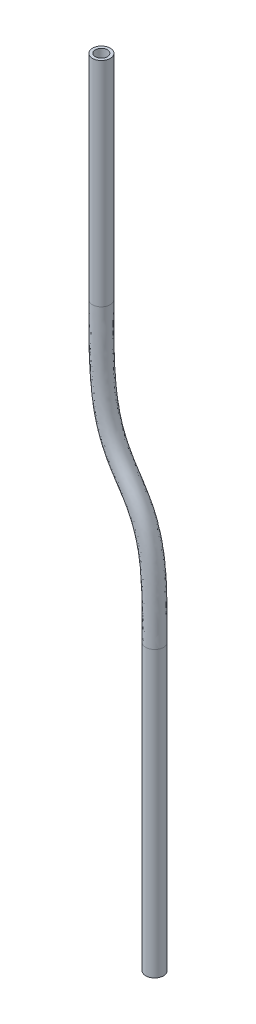
ISO-10303-21;
HEADER;
FILE_DESCRIPTION(('STEP AP214'),'2;1');
FILE_NAME('part.step','',(''),(''),'','','');
FILE_SCHEMA(('AUTOMOTIVE_DESIGN { 1 0 10303 214 1 1 1 1 }'));
ENDSEC;
DATA;
#1=APPLICATION_CONTEXT('core data for automotive mechanical design processes');
#2=APPLICATION_PROTOCOL_DEFINITION('international standard','automotive_design',2000,#1);
#3=PRODUCT_CONTEXT('',#1,'mechanical');
#4=PRODUCT('Part','Part','',(#3));
#5=PRODUCT_RELATED_PRODUCT_CATEGORY('part','',(#4));
#6=PRODUCT_DEFINITION_FORMATION('','',#4);
#7=PRODUCT_DEFINITION_CONTEXT('part definition',#1,'design');
#8=PRODUCT_DEFINITION('design','',#6,#7);
#9=PRODUCT_DEFINITION_SHAPE('','',#8);
#10=(LENGTH_UNIT() NAMED_UNIT(*) SI_UNIT(.MILLI.,.METRE.));
#11=(NAMED_UNIT(*) PLANE_ANGLE_UNIT() SI_UNIT($,.RADIAN.));
#12=(NAMED_UNIT(*) SI_UNIT($,.STERADIAN.) SOLID_ANGLE_UNIT());
#13=UNCERTAINTY_MEASURE_WITH_UNIT(LENGTH_MEASURE(1.E-05),#10,'distance_accuracy_value','');
#14=(GEOMETRIC_REPRESENTATION_CONTEXT(3) GLOBAL_UNCERTAINTY_ASSIGNED_CONTEXT((#13)) GLOBAL_UNIT_ASSIGNED_CONTEXT((#10,
#11,#12)) REPRESENTATION_CONTEXT('',''));
#15=CARTESIAN_POINT('',(0.,0.,0.));
#16=DIRECTION('',(0.,0.,1.));
#17=DIRECTION('',(1.,0.,0.));
#18=AXIS2_PLACEMENT_3D('',#15,#16,#17);
#19=CARTESIAN_POINT('',(0.,0.,0.));
#20=DIRECTION('',(0.,1.,0.));
#21=DIRECTION('',(-1.,0.,0.));
#22=AXIS2_PLACEMENT_3D('',#19,#20,#21);
#23=CYLINDRICAL_SURFACE('',#22,3.175);
#24=CARTESIAN_POINT('',(0.,0.,0.));
#25=DIRECTION('',(0.,-1.,0.));
#26=DIRECTION('',(1.,0.,0.));
#27=AXIS2_PLACEMENT_3D('',#24,#25,#26);
#28=CIRCLE('',#27,3.175);
#29=CARTESIAN_POINT('',(3.17499999999999,0.,0.));
#30=VERTEX_POINT('',#29);
#31=EDGE_CURVE('E125',#30,#30,#28,.T.);
#32=ORIENTED_EDGE('',*,*,#31,.F.);
#33=DIRECTION('',(0.,1.,0.));
#34=VECTOR('',#33,1.);
#35=CARTESIAN_POINT('',(3.17499999999999,0.,0.));
#36=LINE('',#35,#34);
#37=CARTESIAN_POINT('',(3.17499999999999,76.2000000000001,0.));
#38=VERTEX_POINT('',#37);
#39=EDGE_CURVE('E12',#30,#38,#36,.T.);
#40=ORIENTED_EDGE('',*,*,#39,.T.);
#41=CARTESIAN_POINT('',(0.,76.2000000000001,0.));
#42=DIRECTION('',(0.,-1.,0.));
#43=DIRECTION('',(1.,0.,0.));
#44=AXIS2_PLACEMENT_3D('',#41,#42,#43);
#45=CIRCLE('',#44,3.175);
#46=EDGE_CURVE('E85',#38,#38,#45,.T.);
#47=ORIENTED_EDGE('',*,*,#46,.T.);
#48=ORIENTED_EDGE('',*,*,#39,.F.);
#49=EDGE_LOOP('',(#32,#40,#47,#48));
#50=FACE_BOUND('',#49,.T.);
#51=ADVANCED_FACE('F75',(#50),#23,.T.);
#52=CARTESIAN_POINT('',(0.,0.,0.));
#53=DIRECTION('',(0.,1.,0.));
#54=DIRECTION('',(-1.,0.,0.));
#55=AXIS2_PLACEMENT_3D('',#52,#53,#54);
#56=CYLINDRICAL_SURFACE('',#55,2.159);
#57=CARTESIAN_POINT('',(0.,0.,0.));
#58=DIRECTION('',(0.,-1.,0.));
#59=DIRECTION('',(1.,0.,0.));
#60=AXIS2_PLACEMENT_3D('',#57,#58,#59);
#61=CIRCLE('',#60,2.159);
#62=CARTESIAN_POINT('',(2.15899999999999,0.,0.));
#63=VERTEX_POINT('',#62);
#64=EDGE_CURVE('E136',#63,#63,#61,.T.);
#65=ORIENTED_EDGE('',*,*,#64,.T.);
#66=DIRECTION('',(0.,1.,0.));
#67=VECTOR('',#66,1.);
#68=CARTESIAN_POINT('',(2.15899999999999,0.,0.));
#69=LINE('',#68,#67);
#70=CARTESIAN_POINT('',(2.15899999999999,76.2000000000001,0.));
#71=VERTEX_POINT('',#70);
#72=EDGE_CURVE('E131',#63,#71,#69,.T.);
#73=ORIENTED_EDGE('',*,*,#72,.T.);
#74=CARTESIAN_POINT('',(0.,76.2000000000001,0.));
#75=DIRECTION('',(0.,-1.,0.));
#76=DIRECTION('',(1.,0.,0.));
#77=AXIS2_PLACEMENT_3D('',#74,#75,#76);
#78=CIRCLE('',#77,2.159);
#79=EDGE_CURVE('E98',#71,#71,#78,.T.);
#80=ORIENTED_EDGE('',*,*,#79,.F.);
#81=ORIENTED_EDGE('',*,*,#72,.F.);
#82=EDGE_LOOP('',(#65,#73,#80,#81));
#83=FACE_BOUND('',#82,.T.);
#84=ADVANCED_FACE('F167',(#83),#56,.F.);
#85=CARTESIAN_POINT('',(19.05,-96.4559617293823,0.));
#86=DIRECTION('',(0.,-1.,0.));
#87=DIRECTION('',(1.,0.,0.));
#88=AXIS2_PLACEMENT_3D('',#85,#86,#87);
#89=CYLINDRICAL_SURFACE('',#88,2.159);
#90=CARTESIAN_POINT('',(19.05,-96.4559617293823,0.));
#91=DIRECTION('',(0.,-1.,0.));
#92=DIRECTION('',(1.,0.,0.));
#93=AXIS2_PLACEMENT_3D('',#90,#91,#92);
#94=CIRCLE('',#93,2.159);
#95=CARTESIAN_POINT('',(21.209,-96.4559617293823,0.));
#96=VERTEX_POINT('',#95);
#97=EDGE_CURVE('E110',#96,#96,#94,.T.);
#98=ORIENTED_EDGE('',*,*,#97,.F.);
#99=EDGE_LOOP('',(#98));
#100=FACE_BOUND('',#99,.T.);
#101=CARTESIAN_POINT('',(19.05,-198.055961729382,0.));
#102=DIRECTION('',(0.,-1.,0.));
#103=DIRECTION('',(1.,0.,0.));
#104=AXIS2_PLACEMENT_3D('',#101,#102,#103);
#105=CIRCLE('',#104,2.159);
#106=CARTESIAN_POINT('',(21.209,-198.055961729382,0.));
#107=VERTEX_POINT('',#106);
#108=EDGE_CURVE('E122',#107,#107,#105,.T.);
#109=ORIENTED_EDGE('',*,*,#108,.T.);
#110=EDGE_LOOP('',(#109));
#111=FACE_BOUND('',#110,.T.);
#112=ADVANCED_FACE('F111',(#100,#111),#89,.F.);
#113=CARTESIAN_POINT('',(19.05,-96.4559617293823,0.));
#114=DIRECTION('',(0.,-1.,0.));
#115=DIRECTION('',(1.,0.,0.));
#116=AXIS2_PLACEMENT_3D('',#113,#114,#115);
#117=CYLINDRICAL_SURFACE('',#116,3.175);
#118=CARTESIAN_POINT('',(19.05,-96.4559617293823,0.));
#119=DIRECTION('',(0.,-1.,0.));
#120=DIRECTION('',(1.,0.,0.));
#121=AXIS2_PLACEMENT_3D('',#118,#119,#120);
#122=CIRCLE('',#121,3.175);
#123=CARTESIAN_POINT('',(22.225,-96.4559617293823,0.));
#124=VERTEX_POINT('',#123);
#125=EDGE_CURVE('E116',#124,#124,#122,.T.);
#126=ORIENTED_EDGE('',*,*,#125,.T.);
#127=EDGE_LOOP('',(#126));
#128=FACE_BOUND('',#127,.T.);
#129=CARTESIAN_POINT('',(19.05,-198.055961729382,0.));
#130=DIRECTION('',(0.,-1.,0.));
#131=DIRECTION('',(1.,0.,0.));
#132=AXIS2_PLACEMENT_3D('',#129,#130,#131);
#133=CIRCLE('',#132,3.175);
#134=CARTESIAN_POINT('',(22.225,-198.055961729382,0.));
#135=VERTEX_POINT('',#134);
#136=EDGE_CURVE('E117',#135,#135,#133,.T.);
#137=ORIENTED_EDGE('',*,*,#136,.F.);
#138=EDGE_LOOP('',(#137));
#139=FACE_BOUND('',#138,.T.);
#140=ADVANCED_FACE('F149',(#128,#139),#117,.T.);
#141=CARTESIAN_POINT('',(19.05,-198.055961729382,0.));
#142=DIRECTION('',(0.,-1.,0.));
#143=DIRECTION('',(1.,0.,0.));
#144=AXIS2_PLACEMENT_3D('',#141,#142,#143);
#145=PLANE('',#144);
#146=ORIENTED_EDGE('',*,*,#108,.F.);
#147=EDGE_LOOP('',(#146));
#148=FACE_BOUND('',#147,.T.);
#149=ORIENTED_EDGE('',*,*,#136,.T.);
#150=EDGE_LOOP('',(#149));
#151=FACE_BOUND('',#150,.T.);
#152=ADVANCED_FACE('F152',(#148,#151),#145,.T.);
#153=CARTESIAN_POINT('',(0.,76.2000000000001,0.));
#154=DIRECTION('',(0.,-1.,0.));
#155=DIRECTION('',(1.,0.,0.));
#156=AXIS2_PLACEMENT_3D('',#153,#154,#155);
#157=PLANE('',#156);
#158=ORIENTED_EDGE('',*,*,#79,.T.);
#159=EDGE_LOOP('',(#158));
#160=FACE_BOUND('',#159,.T.);
#161=ORIENTED_EDGE('',*,*,#46,.F.);
#162=EDGE_LOOP('',(#161));
#163=FACE_BOUND('',#162,.T.);
#164=ADVANCED_FACE('F157',(#160,#163),#157,.F.);
#165=CARTESIAN_POINT('',(22.225,-96.4559617293823,0.));
#166=CARTESIAN_POINT('',(22.225,-91.0119109936255,0.));
#167=CARTESIAN_POINT('',(22.1983255219202,-78.8834765321268,0.));
#168=CARTESIAN_POINT('',(20.9505032178214,-67.2755601045657,0.));
#169=CARTESIAN_POINT('',(18.0859037602269,-58.0508144624268,0.));
#170=CARTESIAN_POINT('',(14.0520757496162,-51.1831758916745,0.));
#171=CARTESIAN_POINT('',(10.2893681006252,-45.7430928816105,0.));
#172=CARTESIAN_POINT('',(7.35655304304436,-40.3507486722912,0.));
#173=CARTESIAN_POINT('',(5.22679144115826,-34.2606897503014,0.));
#174=CARTESIAN_POINT('',(3.80804832021998,-25.9627554061368,0.));
#175=CARTESIAN_POINT('',(3.18661095277607,-15.2887361010675,0.));
#176=CARTESIAN_POINT('',(3.17499999999999,-4.84579065420873,0.));
#177=CARTESIAN_POINT('',(3.17499999999999,0.,0.));
#178=CARTESIAN_POINT('',(22.225,-96.4559617293823,-6.35));
#179=CARTESIAN_POINT('',(22.225,-91.1563653622159,-6.35));
#180=CARTESIAN_POINT('',(22.1983255219202,-78.8164332912311,-6.35));
#181=CARTESIAN_POINT('',(20.9505032178214,-67.2935298948151,-6.35));
#182=CARTESIAN_POINT('',(18.0859037602268,-58.0459785423249,-6.35));
#183=CARTESIAN_POINT('',(14.0520757496162,-51.1845497818327,-6.35));
#184=CARTESIAN_POINT('',(10.2893681006252,-45.7425784932717,-6.35));
#185=CARTESIAN_POINT('',(7.35655304304435,-40.351520219269,-6.35));
#186=CARTESIAN_POINT('',(5.22679144115826,-34.2580107894528,-6.35));
#187=CARTESIAN_POINT('',(3.80804832021998,-25.9726997025534,-6.35));
#188=CARTESIAN_POINT('',(3.18661095277607,-15.2516378762499,-6.35));
#189=CARTESIAN_POINT('',(3.17499999999999,-4.92572364783858,-6.35));
#190=CARTESIAN_POINT('',(3.17499999999999,0.,-6.35));
#191=CARTESIAN_POINT('',(15.875,-96.4559617293823,-6.35));
#192=CARTESIAN_POINT('',(15.875,-91.1563653622159,-6.35));
#193=CARTESIAN_POINT('',(15.8448310067891,-78.9929845721256,-6.35));
#194=CARTESIAN_POINT('',(14.6521710337135,-68.4086743014929,-6.35));
#195=CARTESIAN_POINT('',(12.2263631447715,-60.6458339685584,-6.35));
#196=CARTESIAN_POINT('',(8.8116955529137,-54.7772079765875,-6.35));
#197=CARTESIAN_POINT('',(4.95750181909223,-49.2107313855515,-6.35));
#198=CARTESIAN_POINT('',(1.5194801211589,-42.9360358547135,-6.35));
#199=CARTESIAN_POINT('',(-0.97541756226488,-35.753418135562,-6.35));
#200=CARTESIAN_POINT('',(-2.52531672454958,-26.5795201729805,-6.35));
#201=CARTESIAN_POINT('',(-3.1646920303885,-15.3522980140792,-6.35));
#202=CARTESIAN_POINT('',(-3.17500000000001,-4.92572364783858,-6.35));
#203=CARTESIAN_POINT('',(-3.17500000000001,0.,-6.35));
#204=CARTESIAN_POINT('',(15.875,-96.4559617293823,0.));
#205=CARTESIAN_POINT('',(15.875,-91.0841381779207,0.));
#206=CARTESIAN_POINT('',(15.8448310067891,-79.0265061925735,0.));
#207=CARTESIAN_POINT('',(14.6521710337135,-68.3996894063682,0.));
#208=CARTESIAN_POINT('',(12.2263631447715,-60.6482519286093,0.));
#209=CARTESIAN_POINT('',(8.81169555291371,-54.7765210315084,0.));
#210=CARTESIAN_POINT('',(4.95750181909224,-49.2109885797209,0.));
#211=CARTESIAN_POINT('',(1.5194801211589,-42.9356500812247,0.));
#212=CARTESIAN_POINT('',(-0.975417562264881,-35.7547576159862,0.));
#213=CARTESIAN_POINT('',(-2.52531672454958,-26.5745480247722,0.));
#214=CARTESIAN_POINT('',(-3.16469203038851,-15.370847126488,0.));
#215=CARTESIAN_POINT('',(-3.17500000000001,-4.88575715102366,0.));
#216=CARTESIAN_POINT('',(-3.17500000000001,0.,0.));
#217=CARTESIAN_POINT('',(15.875,-96.4559617293823,6.35));
#218=CARTESIAN_POINT('',(15.875,-91.0119109936255,6.35));
#219=CARTESIAN_POINT('',(15.8448310067891,-79.0600278130213,6.35));
#220=CARTESIAN_POINT('',(14.6521710337135,-68.3907045112435,6.35));
#221=CARTESIAN_POINT('',(12.2263631447715,-60.6506698886603,6.35));
#222=CARTESIAN_POINT('',(8.8116955529137,-54.7758340864293,6.35));
#223=CARTESIAN_POINT('',(4.95750181909223,-49.2112457738903,6.35));
#224=CARTESIAN_POINT('',(1.5194801211589,-42.9352643077358,6.35));
#225=CARTESIAN_POINT('',(-0.97541756226488,-35.7560970964105,6.35));
#226=CARTESIAN_POINT('',(-2.52531672454958,-26.569575876564,6.35));
#227=CARTESIAN_POINT('',(-3.1646920303885,-15.3893962388967,6.35));
#228=CARTESIAN_POINT('',(-3.17500000000001,-4.84579065420873,6.35));
#229=CARTESIAN_POINT('',(-3.17500000000001,0.,6.35));
#230=CARTESIAN_POINT('',(22.225,-96.4559617293823,6.35));
#231=CARTESIAN_POINT('',(22.225,-90.8674566250351,6.35));
#232=CARTESIAN_POINT('',(22.1983255219202,-78.9505197730226,6.35));
#233=CARTESIAN_POINT('',(20.9505032178214,-67.2575903143163,6.35));
#234=CARTESIAN_POINT('',(18.0859037602268,-58.0556503825287,6.35));
#235=CARTESIAN_POINT('',(14.0520757496162,-51.1818020015163,6.35));
#236=CARTESIAN_POINT('',(10.2893681006252,-45.7436072699493,6.35));
#237=CARTESIAN_POINT('',(7.35655304304435,-40.3499771253135,6.35));
#238=CARTESIAN_POINT('',(5.22679144115826,-34.2633687111499,6.35));
#239=CARTESIAN_POINT('',(3.80804832021998,-25.9528111097203,6.35));
#240=CARTESIAN_POINT('',(3.18661095277607,-15.325834325885,6.35));
#241=CARTESIAN_POINT('',(3.17499999999999,-4.76585766057889,6.35));
#242=CARTESIAN_POINT('',(3.17499999999999,0.,6.35));
#243=CARTESIAN_POINT('',(22.225,-96.4559617293823,0.));
#244=CARTESIAN_POINT('',(22.225,-91.0119109936255,0.));
#245=CARTESIAN_POINT('',(22.1983255219202,-78.8834765321268,0.));
#246=CARTESIAN_POINT('',(20.9505032178214,-67.2755601045657,0.));
#247=CARTESIAN_POINT('',(18.0859037602269,-58.0508144624268,0.));
#248=CARTESIAN_POINT('',(14.0520757496162,-51.1831758916745,0.));
#249=CARTESIAN_POINT('',(10.2893681006252,-45.7430928816105,0.));
#250=CARTESIAN_POINT('',(7.35655304304436,-40.3507486722912,0.));
#251=CARTESIAN_POINT('',(5.22679144115826,-34.2606897503014,0.));
#252=CARTESIAN_POINT('',(3.80804832021998,-25.9627554061368,0.));
#253=CARTESIAN_POINT('',(3.18661095277607,-15.2887361010675,0.));
#254=CARTESIAN_POINT('',(3.17499999999999,-4.84579065420873,0.));
#255=CARTESIAN_POINT('',(3.17499999999999,0.,0.));
#256=(BOUNDED_SURFACE() B_SPLINE_SURFACE(3,3,((#165,#166,#167,#168,#169,#170,#171,#172,#173,
#174,#175,#176,#177),(#178,#179,#180,#181,#182,#183,#184,#185,#186,#187,#188,#189,#190),(#191,
#192,#193,#194,#195,#196,#197,#198,#199,#200,#201,#202,#203),(#204,#205,#206,#207,#208,#209,
#210,#211,#212,#213,#214,#215,#216),(#217,#218,#219,#220,#221,#222,#223,#224,#225,#226,#227,
#228,#229),(#230,#231,#232,#233,#234,#235,#236,#237,#238,#239,#240,#241,#242),(#243,#244,#245,
#246,#247,#248,#249,#250,#251,#252,#253,#254,#255)),.UNSPECIFIED.,.T.,.F.,
.F.) B_SPLINE_SURFACE_WITH_KNOTS((4,3,4),(4,1,1,1,1,1,1,1,1,1,4),(0.,0.5,1.),(0.,0.112,0.224,
0.336,0.448,0.56,0.648,0.736,0.824000000000001,0.912,1.),
.UNSPECIFIED.) GEOMETRIC_REPRESENTATION_ITEM() RATIONAL_B_SPLINE_SURFACE(((1.,1.,1.,1.,1.,1.,1.,
1.,1.,1.,1.,1.,1.),(0.333333333333333,0.333333333333333,0.333333333333333,0.333333333333333,
0.333333333333333,0.333333333333333,0.333333333333333,0.333333333333333,0.333333333333333,
0.333333333333333,0.333333333333333,0.333333333333333,0.333333333333333),(0.333333333333333,
0.333333333333333,0.333333333333333,0.333333333333333,0.333333333333333,0.333333333333333,
0.333333333333333,0.333333333333333,0.333333333333333,0.333333333333333,0.333333333333333,
0.333333333333333,0.333333333333333),(1.,1.,1.,1.,1.,1.,1.,1.,1.,1.,1.,1.,1.),
(0.333333333333333,0.333333333333333,0.333333333333333,0.333333333333333,0.333333333333333,
0.333333333333333,0.333333333333333,0.333333333333333,0.333333333333333,0.333333333333333,
0.333333333333333,0.333333333333333,0.333333333333333),(0.333333333333333,0.333333333333333,
0.333333333333333,0.333333333333333,0.333333333333333,0.333333333333333,0.333333333333333,
0.333333333333333,0.333333333333333,0.333333333333333,0.333333333333333,0.333333333333333,
0.333333333333333),(1.,1.,1.,1.,1.,1.,1.,1.,1.,1.,1.,1.,1.))) REPRESENTATION_ITEM('') SURFACE());
#257=CARTESIAN_POINT('',(22.225,-96.4559617293823,0.));
#258=CARTESIAN_POINT('',(22.225,-91.0119109936255,0.));
#259=CARTESIAN_POINT('',(22.1983255219202,-78.8834765321268,0.));
#260=CARTESIAN_POINT('',(20.9505032178214,-67.2755601045657,0.));
#261=CARTESIAN_POINT('',(18.0859037602269,-58.0508144624268,0.));
#262=CARTESIAN_POINT('',(14.0520757496162,-51.1831758916745,0.));
#263=CARTESIAN_POINT('',(10.2893681006252,-45.7430928816105,0.));
#264=CARTESIAN_POINT('',(7.35655304304436,-40.3507486722912,0.));
#265=CARTESIAN_POINT('',(5.22679144115826,-34.2606897503014,0.));
#266=CARTESIAN_POINT('',(3.80804832021998,-25.9627554061368,0.));
#267=CARTESIAN_POINT('',(3.18661095277607,-15.2887361010675,0.));
#268=CARTESIAN_POINT('',(3.17499999999999,-4.84579065420873,0.));
#269=CARTESIAN_POINT('',(3.17499999999999,0.,0.));
#270=B_SPLINE_CURVE_WITH_KNOTS('',3,(#257,#258,#259,#260,#261,#262,#263,#264,#265,#266,#267,
#268,#269),.UNSPECIFIED.,.F.,.F.,(4,1,1,1,1,1,1,1,1,1,4),(0.,0.112,0.224,0.336,0.448,0.56,0.648,
0.736,0.824000000000001,0.912,1.),.UNSPECIFIED.);
#271=EDGE_CURVE('E78',#124,#30,#270,.T.);
#272=ORIENTED_EDGE('',*,*,#125,.F.);
#273=ORIENTED_EDGE('',*,*,#271,.T.);
#274=ORIENTED_EDGE('',*,*,#31,.T.);
#275=ORIENTED_EDGE('',*,*,#271,.F.);
#276=EDGE_LOOP('',(#272,#273,#274,#275));
#277=FACE_BOUND('',#276,.T.);
#278=ADVANCED_FACE('F146',(#277),#256,.T.);
#279=CARTESIAN_POINT('',(21.209,-96.4559617293823,0.));
#280=CARTESIAN_POINT('',(21.209,-91.0119110028868,0.));
#281=CARTESIAN_POINT('',(21.1817663994992,-78.9117247327718,0.));
#282=CARTESIAN_POINT('',(19.9427700683642,-67.4539832107859,0.));
#283=CARTESIAN_POINT('',(17.148377261754,-58.4667913303156,0.));
#284=CARTESIAN_POINT('',(13.2136149181438,-51.7580012029178,0.));
#285=CARTESIAN_POINT('',(9.43626949557993,-46.297997344361,0.));
#286=CARTESIAN_POINT('',(6.42262137554269,-40.7642711739585,0.));
#287=CARTESIAN_POINT('',(4.23443800061056,-34.4999549257079,0.));
#288=CARTESIAN_POINT('',(2.79470991305685,-26.0598466812928,0.));
#289=CARTESIAN_POINT('',(2.17040247546974,-15.3048417235404,0.));
#290=CARTESIAN_POINT('',(2.15899999999999,-4.84579065330309,0.));
#291=CARTESIAN_POINT('',(2.15899999999999,0.,0.));
#292=CARTESIAN_POINT('',(21.209,-96.4559617293823,-4.318));
#293=CARTESIAN_POINT('',(21.209,-91.1101399736954,-4.318));
#294=CARTESIAN_POINT('',(21.1817663994992,-78.8661353288851,-4.318));
#295=CARTESIAN_POINT('',(19.9427700683642,-67.4662026681762,-4.318));
#296=CARTESIAN_POINT('',(17.148377261754,-58.4635029046407,-4.318));
#297=CARTESIAN_POINT('',(13.2136149181438,-51.7589354482269,-4.318));
#298=CARTESIAN_POINT('',(9.43626949557992,-46.2976475602902,-4.318));
#299=CARTESIAN_POINT('',(6.42262137554269,-40.7647958259035,-4.318));
#300=CARTESIAN_POINT('',(4.23443800061056,-34.4981332323305,-4.318));
#301=CARTESIAN_POINT('',(2.79470991305685,-26.0666088028574,-4.318));
#302=CARTESIAN_POINT('',(2.17040247546974,-15.2796149306597,-4.318));
#303=CARTESIAN_POINT('',(2.15899999999999,-4.90014508898154,-4.318));
#304=CARTESIAN_POINT('',(2.15899999999999,0.,-4.318));
#305=CARTESIAN_POINT('',(16.891,-96.4559617293823,-4.318));
#306=CARTESIAN_POINT('',(16.891,-91.1101399736954,-4.318));
#307=CARTESIAN_POINT('',(16.8613901292101,-78.9861901998934,-4.318));
#308=CARTESIAN_POINT('',(15.6599041831707,-68.2245008647171,-4.318));
#309=CARTESIAN_POINT('',(13.1638896432444,-60.2314045944795,-4.318));
#310=CARTESIAN_POINT('',(9.65015638438612,-54.2019430206602,-4.318));
#311=CARTESIAN_POINT('',(5.8106004241375,-48.6559915270405,-4.318));
#312=CARTESIAN_POINT('',(2.45341178866057,-42.5222664580058,-4.318));
#313=CARTESIAN_POINT('',(0.0169358782828218,-35.5150102276847,-4.318));
#314=CARTESIAN_POINT('',(-1.51197831738645,-26.4792467227479,-4.318));
#315=CARTESIAN_POINT('',(-2.14848355308218,-15.3480638243836,-4.318));
#316=CARTESIAN_POINT('',(-2.15900000000002,-4.90014508898154,-4.318));
#317=CARTESIAN_POINT('',(-2.15900000000002,0.,-4.318));
#318=CARTESIAN_POINT('',(16.891,-96.4559617293823,0.));
#319=CARTESIAN_POINT('',(16.891,-91.0610254882911,0.));
#320=CARTESIAN_POINT('',(16.8613901292101,-79.0089849018367,0.));
#321=CARTESIAN_POINT('',(15.6599041831708,-68.2183911360219,0.));
#322=CARTESIAN_POINT('',(13.1638896432444,-60.2330488073169,0.));
#323=CARTESIAN_POINT('',(9.65015638438612,-54.2014758980056,0.));
#324=CARTESIAN_POINT('',(5.8106004241375,-48.6561664190759,0.));
#325=CARTESIAN_POINT('',(2.45341178866058,-42.5220041320333,0.));
#326=CARTESIAN_POINT('',(0.0169358782828295,-35.5159210743734,0.));
#327=CARTESIAN_POINT('',(-1.51197831738645,-26.4758656619656,0.));
#328=CARTESIAN_POINT('',(-2.14848355308218,-15.360677220824,0.));
#329=CARTESIAN_POINT('',(-2.15900000000001,-4.87296787114231,0.));
#330=CARTESIAN_POINT('',(-2.15900000000001,0.,0.));
#331=CARTESIAN_POINT('',(16.891,-96.4559617293823,4.318));
#332=CARTESIAN_POINT('',(16.891,-91.0119110028868,4.318));
#333=CARTESIAN_POINT('',(16.8613901292101,-79.03177960378,4.318));
#334=CARTESIAN_POINT('',(15.6599041831707,-68.2122814073267,4.318));
#335=CARTESIAN_POINT('',(13.1638896432444,-60.2346930201543,4.318));
#336=CARTESIAN_POINT('',(9.65015638438612,-54.2010087753511,4.318));
#337=CARTESIAN_POINT('',(5.8106004241375,-48.6563413111113,4.318));
#338=CARTESIAN_POINT('',(2.45341178866057,-42.5217418060607,4.318));
#339=CARTESIAN_POINT('',(0.0169358782828218,-35.5168319210621,4.318));
#340=CARTESIAN_POINT('',(-1.51197831738645,-26.4724846011833,4.318));
#341=CARTESIAN_POINT('',(-2.14848355308218,-15.3732906172642,4.318));
#342=CARTESIAN_POINT('',(-2.15900000000002,-4.84579065330309,4.318));
#343=CARTESIAN_POINT('',(-2.15900000000002,0.,4.318));
#344=CARTESIAN_POINT('',(21.209,-96.4559617293823,4.318));
#345=CARTESIAN_POINT('',(21.209,-90.9136820320782,4.318));
#346=CARTESIAN_POINT('',(21.1817663994992,-78.9573141366584,4.318));
#347=CARTESIAN_POINT('',(19.9427700683642,-67.4417637533955,4.318));
#348=CARTESIAN_POINT('',(17.148377261754,-58.4700797559904,4.318));
#349=CARTESIAN_POINT('',(13.2136149181438,-51.7570669576087,4.318));
#350=CARTESIAN_POINT('',(9.43626949557992,-46.2983471284317,4.318));
#351=CARTESIAN_POINT('',(6.42262137554269,-40.7637465220134,4.318));
#352=CARTESIAN_POINT('',(4.23443800061056,-34.5017766190853,4.318));
#353=CARTESIAN_POINT('',(2.79470991305685,-26.0530845597284,4.318));
#354=CARTESIAN_POINT('',(2.17040247546974,-15.330068516421,4.318));
#355=CARTESIAN_POINT('',(2.15899999999999,-4.79143621762464,4.318));
#356=CARTESIAN_POINT('',(2.15899999999999,0.,4.318));
#357=CARTESIAN_POINT('',(21.209,-96.4559617293823,0.));
#358=CARTESIAN_POINT('',(21.209,-91.0119110028868,0.));
#359=CARTESIAN_POINT('',(21.1817663994992,-78.9117247327718,0.));
#360=CARTESIAN_POINT('',(19.9427700683642,-67.4539832107859,0.));
#361=CARTESIAN_POINT('',(17.148377261754,-58.4667913303156,0.));
#362=CARTESIAN_POINT('',(13.2136149181438,-51.7580012029178,0.));
#363=CARTESIAN_POINT('',(9.43626949557993,-46.297997344361,0.));
#364=CARTESIAN_POINT('',(6.42262137554269,-40.7642711739585,0.));
#365=CARTESIAN_POINT('',(4.23443800061056,-34.4999549257079,0.));
#366=CARTESIAN_POINT('',(2.79470991305685,-26.0598466812928,0.));
#367=CARTESIAN_POINT('',(2.17040247546974,-15.3048417235404,0.));
#368=CARTESIAN_POINT('',(2.15899999999999,-4.84579065330309,0.));
#369=CARTESIAN_POINT('',(2.15899999999999,0.,0.));
#370=(BOUNDED_SURFACE() B_SPLINE_SURFACE(3,3,((#279,#280,#281,#282,#283,#284,#285,#286,#287,
#288,#289,#290,#291),(#292,#293,#294,#295,#296,#297,#298,#299,#300,#301,#302,#303,#304),(#305,
#306,#307,#308,#309,#310,#311,#312,#313,#314,#315,#316,#317),(#318,#319,#320,#321,#322,#323,
#324,#325,#326,#327,#328,#329,#330),(#331,#332,#333,#334,#335,#336,#337,#338,#339,#340,#341,
#342,#343),(#344,#345,#346,#347,#348,#349,#350,#351,#352,#353,#354,#355,#356),(#357,#358,#359,
#360,#361,#362,#363,#364,#365,#366,#367,#368,#369)),.UNSPECIFIED.,.T.,.F.,
.F.) B_SPLINE_SURFACE_WITH_KNOTS((4,3,4),(4,1,1,1,1,1,1,1,1,1,4),(0.,0.5,1.),(0.,0.112,0.224,
0.336,0.448,0.56,0.648,0.736,0.824000000000001,0.912,1.),
.UNSPECIFIED.) GEOMETRIC_REPRESENTATION_ITEM() RATIONAL_B_SPLINE_SURFACE(((1.,1.,1.,1.,1.,1.,1.,
1.,1.,1.,1.,1.,1.),(0.333333333333333,0.333333333333333,0.333333333333333,0.333333333333333,
0.333333333333333,0.333333333333333,0.333333333333333,0.333333333333333,0.333333333333333,
0.333333333333333,0.333333333333333,0.333333333333333,0.333333333333333),(0.333333333333333,
0.333333333333333,0.333333333333333,0.333333333333333,0.333333333333333,0.333333333333333,
0.333333333333333,0.333333333333333,0.333333333333333,0.333333333333333,0.333333333333333,
0.333333333333333,0.333333333333333),(1.,1.,1.,1.,1.,1.,1.,1.,1.,1.,1.,1.,1.),
(0.333333333333333,0.333333333333333,0.333333333333333,0.333333333333333,0.333333333333333,
0.333333333333333,0.333333333333333,0.333333333333333,0.333333333333333,0.333333333333333,
0.333333333333333,0.333333333333333,0.333333333333333),(0.333333333333333,0.333333333333333,
0.333333333333333,0.333333333333333,0.333333333333333,0.333333333333333,0.333333333333333,
0.333333333333333,0.333333333333333,0.333333333333333,0.333333333333333,0.333333333333333,
0.333333333333333),(1.,1.,1.,1.,1.,1.,1.,1.,1.,1.,1.,1.,1.))) REPRESENTATION_ITEM('') SURFACE());
#371=CARTESIAN_POINT('',(21.209,-96.4559617293823,0.));
#372=CARTESIAN_POINT('',(21.209,-91.0119110028868,0.));
#373=CARTESIAN_POINT('',(21.1817663994992,-78.9117247327718,0.));
#374=CARTESIAN_POINT('',(19.9427700683642,-67.4539832107859,0.));
#375=CARTESIAN_POINT('',(17.148377261754,-58.4667913303156,0.));
#376=CARTESIAN_POINT('',(13.2136149181438,-51.7580012029178,0.));
#377=CARTESIAN_POINT('',(9.43626949557993,-46.297997344361,0.));
#378=CARTESIAN_POINT('',(6.42262137554269,-40.7642711739585,0.));
#379=CARTESIAN_POINT('',(4.23443800061056,-34.4999549257079,0.));
#380=CARTESIAN_POINT('',(2.79470991305685,-26.0598466812928,0.));
#381=CARTESIAN_POINT('',(2.17040247546974,-15.3048417235404,0.));
#382=CARTESIAN_POINT('',(2.15899999999999,-4.84579065330309,0.));
#383=CARTESIAN_POINT('',(2.15899999999999,0.,0.));
#384=B_SPLINE_CURVE_WITH_KNOTS('',3,(#371,#372,#373,#374,#375,#376,#377,#378,#379,#380,#381,
#382,#383),.UNSPECIFIED.,.F.,.F.,(4,1,1,1,1,1,1,1,1,1,4),(0.,0.112,0.224,0.336,0.448,0.56,0.648,
0.736,0.824000000000001,0.912,1.),.UNSPECIFIED.);
#385=EDGE_CURVE('E133',#96,#63,#384,.T.);
#386=ORIENTED_EDGE('',*,*,#97,.T.);
#387=ORIENTED_EDGE('',*,*,#385,.T.);
#388=ORIENTED_EDGE('',*,*,#64,.F.);
#389=ORIENTED_EDGE('',*,*,#385,.F.);
#390=EDGE_LOOP('',(#386,#387,#388,#389));
#391=FACE_BOUND('',#390,.T.);
#392=ADVANCED_FACE('F175',(#391),#370,.F.);
#393=CLOSED_SHELL('',(#51,#84,#112,#140,#152,#164,#278,#392));
#394=MANIFOLD_SOLID_BREP('B2',#393);
#395=ADVANCED_BREP_SHAPE_REPRESENTATION('',(#18,#394),#14);
#396=SHAPE_DEFINITION_REPRESENTATION(#9,#395);
ENDSEC;
END-ISO-10303-21;
